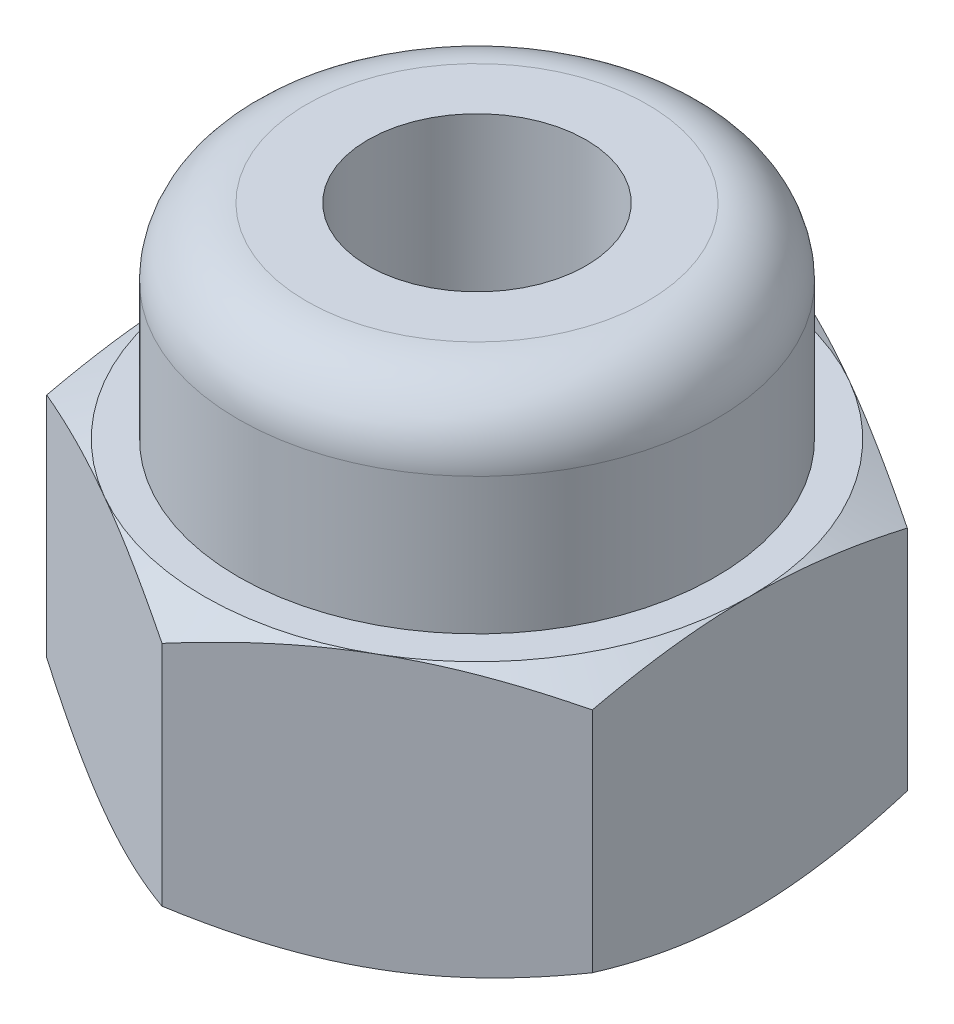
ISO-10303-21;
HEADER;
FILE_DESCRIPTION(('STEP AP214'),'2;1');
FILE_NAME('part.step','',(''),(''),'','','');
FILE_SCHEMA(('AUTOMOTIVE_DESIGN { 1 0 10303 214 1 1 1 1 }'));
ENDSEC;
DATA;
#1=APPLICATION_CONTEXT('core data for automotive mechanical design processes');
#2=APPLICATION_PROTOCOL_DEFINITION('international standard','automotive_design',2000,#1);
#3=PRODUCT_CONTEXT('',#1,'mechanical');
#4=PRODUCT('Part','Part','',(#3));
#5=PRODUCT_RELATED_PRODUCT_CATEGORY('part','',(#4));
#6=PRODUCT_DEFINITION_FORMATION('','',#4);
#7=PRODUCT_DEFINITION_CONTEXT('part definition',#1,'design');
#8=PRODUCT_DEFINITION('design','',#6,#7);
#9=PRODUCT_DEFINITION_SHAPE('','',#8);
#10=(LENGTH_UNIT() NAMED_UNIT(*) SI_UNIT(.MILLI.,.METRE.));
#11=(NAMED_UNIT(*) PLANE_ANGLE_UNIT() SI_UNIT($,.RADIAN.));
#12=(NAMED_UNIT(*) SI_UNIT($,.STERADIAN.) SOLID_ANGLE_UNIT());
#13=UNCERTAINTY_MEASURE_WITH_UNIT(LENGTH_MEASURE(1.E-05),#10,'distance_accuracy_value','');
#14=(GEOMETRIC_REPRESENTATION_CONTEXT(3) GLOBAL_UNCERTAINTY_ASSIGNED_CONTEXT((#13)) GLOBAL_UNIT_ASSIGNED_CONTEXT((#10,
#11,#12)) REPRESENTATION_CONTEXT('',''));
#15=CARTESIAN_POINT('',(0.,0.,0.));
#16=DIRECTION('',(0.,0.,1.));
#17=DIRECTION('',(1.,0.,0.));
#18=AXIS2_PLACEMENT_3D('',#15,#16,#17);
#19=CARTESIAN_POINT('',(0.,2.,0.));
#20=DIRECTION('',(0.,1.,0.));
#21=DIRECTION('',(0.,0.,1.));
#22=AXIS2_PLACEMENT_3D('',#19,#20,#21);
#23=PLANE('',#22);
#24=CARTESIAN_POINT('',(0.,2.,0.));
#25=DIRECTION('',(0.,1.,0.));
#26=DIRECTION('',(0.,0.,1.));
#27=AXIS2_PLACEMENT_3D('',#24,#25,#26);
#28=CIRCLE('',#27,1.75);
#29=CARTESIAN_POINT('',(0.,2.,1.75));
#30=VERTEX_POINT('',#29);
#31=EDGE_CURVE('E263',#30,#30,#28,.T.);
#32=ORIENTED_EDGE('',*,*,#31,.F.);
#33=EDGE_LOOP('',(#32));
#34=FACE_BOUND('',#33,.T.);
#35=CARTESIAN_POINT('',(0.,2.,0.));
#36=DIRECTION('',(0.,1.,0.));
#37=DIRECTION('',(0.,0.,1.));
#38=AXIS2_PLACEMENT_3D('',#35,#36,#37);
#39=CIRCLE('',#38,2.);
#40=CARTESIAN_POINT('',(-1.,2.,1.73205080756888));
#41=VERTEX_POINT('',#40);
#42=CARTESIAN_POINT('',(-2.,2.,0.));
#43=VERTEX_POINT('',#42);
#44=EDGE_CURVE('E11',#41,#43,#39,.F.);
#45=ORIENTED_EDGE('',*,*,#44,.F.);
#46=CARTESIAN_POINT('',(1.,2.,1.73205080756888));
#47=VERTEX_POINT('',#46);
#48=EDGE_CURVE('E47',#47,#41,#39,.F.);
#49=ORIENTED_EDGE('',*,*,#48,.F.);
#50=CARTESIAN_POINT('',(0.,2.,0.));
#51=DIRECTION('',(0.,-1.,0.));
#52=DIRECTION('',(1.,0.,0.));
#53=AXIS2_PLACEMENT_3D('',#50,#51,#52);
#54=CIRCLE('',#53,2.);
#55=CARTESIAN_POINT('',(2.,2.,0.));
#56=VERTEX_POINT('',#55);
#57=EDGE_CURVE('E157',#56,#47,#54,.T.);
#58=ORIENTED_EDGE('',*,*,#57,.F.);
#59=CARTESIAN_POINT('',(1.,2.,-1.73205080756888));
#60=VERTEX_POINT('',#59);
#61=EDGE_CURVE('E292',#60,#56,#39,.F.);
#62=ORIENTED_EDGE('',*,*,#61,.F.);
#63=CARTESIAN_POINT('',(-1.,2.,-1.73205080756888));
#64=VERTEX_POINT('',#63);
#65=EDGE_CURVE('E331',#64,#60,#39,.F.);
#66=ORIENTED_EDGE('',*,*,#65,.F.);
#67=EDGE_CURVE('E52',#43,#64,#39,.F.);
#68=ORIENTED_EDGE('',*,*,#67,.F.);
#69=EDGE_LOOP('',(#45,#49,#58,#62,#66,#68));
#70=FACE_BOUND('',#69,.T.);
#71=ADVANCED_FACE('F43',(#34,#70),#23,.T.);
#72=CARTESIAN_POINT('',(0.,0.,0.));
#73=DIRECTION('',(0.,1.,0.));
#74=DIRECTION('',(0.,0.,1.));
#75=AXIS2_PLACEMENT_3D('',#72,#73,#74);
#76=PLANE('',#75);
#77=CARTESIAN_POINT('',(0.,0.,0.));
#78=DIRECTION('',(0.,-1.,0.));
#79=DIRECTION('',(0.,0.,-1.));
#80=AXIS2_PLACEMENT_3D('',#77,#78,#79);
#81=CIRCLE('',#80,0.8);
#82=CARTESIAN_POINT('',(0.,0.,-0.8));
#83=VERTEX_POINT('',#82);
#84=EDGE_CURVE('E260',#83,#83,#81,.T.);
#85=ORIENTED_EDGE('',*,*,#84,.F.);
#86=EDGE_LOOP('',(#85));
#87=FACE_BOUND('',#86,.T.);
#88=CARTESIAN_POINT('',(0.,0.,0.));
#89=DIRECTION('',(0.,1.,0.));
#90=DIRECTION('',(0.,0.,1.));
#91=AXIS2_PLACEMENT_3D('',#88,#89,#90);
#92=CIRCLE('',#91,2.);
#93=CARTESIAN_POINT('',(1.,0.,1.73205080756888));
#94=VERTEX_POINT('',#93);
#95=CARTESIAN_POINT('',(-1.,0.,1.73205080756888));
#96=VERTEX_POINT('',#95);
#97=EDGE_CURVE('E163',#94,#96,#92,.F.);
#98=ORIENTED_EDGE('',*,*,#97,.T.);
#99=CARTESIAN_POINT('',(-2.,0.,0.));
#100=VERTEX_POINT('',#99);
#101=EDGE_CURVE('E286',#96,#100,#92,.F.);
#102=ORIENTED_EDGE('',*,*,#101,.T.);
#103=CARTESIAN_POINT('',(-1.,0.,-1.73205080756888));
#104=VERTEX_POINT('',#103);
#105=EDGE_CURVE('E289',#100,#104,#92,.F.);
#106=ORIENTED_EDGE('',*,*,#105,.T.);
#107=CARTESIAN_POINT('',(1.,0.,-1.73205080756888));
#108=VERTEX_POINT('',#107);
#109=EDGE_CURVE('E162',#104,#108,#92,.F.);
#110=ORIENTED_EDGE('',*,*,#109,.T.);
#111=CARTESIAN_POINT('',(2.,0.,0.));
#112=VERTEX_POINT('',#111);
#113=EDGE_CURVE('E137',#108,#112,#92,.F.);
#114=ORIENTED_EDGE('',*,*,#113,.T.);
#115=CARTESIAN_POINT('',(0.,0.,0.));
#116=DIRECTION('',(0.,-1.,0.));
#117=DIRECTION('',(1.,0.,0.));
#118=AXIS2_PLACEMENT_3D('',#115,#116,#117);
#119=CIRCLE('',#118,2.);
#120=EDGE_CURVE('E149',#112,#94,#119,.T.);
#121=ORIENTED_EDGE('',*,*,#120,.T.);
#122=EDGE_LOOP('',(#98,#102,#106,#110,#114,#121));
#123=FACE_BOUND('',#122,.T.);
#124=ADVANCED_FACE('F159',(#87,#123),#76,.F.);
#125=CARTESIAN_POINT('',(0.,3.5,0.));
#126=DIRECTION('',(0.,-1.,0.));
#127=DIRECTION('',(0.,0.,-1.));
#128=AXIS2_PLACEMENT_3D('',#125,#126,#127);
#129=CYLINDRICAL_SURFACE('',#128,1.75);
#130=CARTESIAN_POINT('',(0.,3.,0.));
#131=DIRECTION('',(0.,1.,0.));
#132=DIRECTION('',(0.,0.,1.));
#133=AXIS2_PLACEMENT_3D('',#130,#131,#132);
#134=CIRCLE('',#133,1.75);
#135=CARTESIAN_POINT('',(0.,3.,1.75));
#136=VERTEX_POINT('',#135);
#137=EDGE_CURVE('E284',#136,#136,#134,.F.);
#138=ORIENTED_EDGE('',*,*,#137,.T.);
#139=EDGE_LOOP('',(#138));
#140=FACE_BOUND('',#139,.T.);
#141=ORIENTED_EDGE('',*,*,#31,.T.);
#142=EDGE_LOOP('',(#141));
#143=FACE_BOUND('',#142,.T.);
#144=ADVANCED_FACE('F374',(#140,#143),#129,.T.);
#145=CARTESIAN_POINT('',(0.,3.5,0.));
#146=DIRECTION('',(0.,1.,0.));
#147=DIRECTION('',(0.,0.,1.));
#148=AXIS2_PLACEMENT_3D('',#145,#146,#147);
#149=PLANE('',#148);
#150=CARTESIAN_POINT('',(0.,3.5,0.));
#151=DIRECTION('',(0.,-1.,0.));
#152=DIRECTION('',(0.,0.,-1.));
#153=AXIS2_PLACEMENT_3D('',#150,#151,#152);
#154=CIRCLE('',#153,0.8);
#155=CARTESIAN_POINT('',(0.,3.5,-0.8));
#156=VERTEX_POINT('',#155);
#157=EDGE_CURVE('E257',#156,#156,#154,.T.);
#158=ORIENTED_EDGE('',*,*,#157,.T.);
#159=EDGE_LOOP('',(#158));
#160=FACE_BOUND('',#159,.T.);
#161=CARTESIAN_POINT('',(0.,3.5,0.));
#162=DIRECTION('',(0.,1.,0.));
#163=DIRECTION('',(0.,0.,1.));
#164=AXIS2_PLACEMENT_3D('',#161,#162,#163);
#165=CIRCLE('',#164,1.25);
#166=CARTESIAN_POINT('',(0.,3.5,1.25));
#167=VERTEX_POINT('',#166);
#168=EDGE_CURVE('E266',#167,#167,#165,.T.);
#169=ORIENTED_EDGE('',*,*,#168,.T.);
#170=EDGE_LOOP('',(#169));
#171=FACE_BOUND('',#170,.T.);
#172=ADVANCED_FACE('F437',(#160,#171),#149,.T.);
#173=CARTESIAN_POINT('',(0.,3.,0.));
#174=DIRECTION('',(0.,1.,0.));
#175=DIRECTION('',(0.,0.,1.));
#176=AXIS2_PLACEMENT_3D('',#173,#174,#175);
#177=TOROIDAL_SURFACE('',#176,1.25,0.5);
#178=ORIENTED_EDGE('',*,*,#137,.F.);
#179=EDGE_LOOP('',(#178));
#180=FACE_BOUND('',#179,.T.);
#181=ORIENTED_EDGE('',*,*,#168,.F.);
#182=EDGE_LOOP('',(#181));
#183=FACE_BOUND('',#182,.T.);
#184=ADVANCED_FACE('F45',(#180,#183),#177,.T.);
#185=CARTESIAN_POINT('',(0.,3.5,0.));
#186=DIRECTION('',(0.,-1.,0.));
#187=DIRECTION('',(0.,0.,-1.));
#188=AXIS2_PLACEMENT_3D('',#185,#186,#187);
#189=CYLINDRICAL_SURFACE('',#188,0.8);
#190=ORIENTED_EDGE('',*,*,#157,.F.);
#191=EDGE_LOOP('',(#190));
#192=FACE_BOUND('',#191,.T.);
#193=ORIENTED_EDGE('',*,*,#84,.T.);
#194=EDGE_LOOP('',(#193));
#195=FACE_BOUND('',#194,.T.);
#196=ADVANCED_FACE('F358',(#192,#195),#189,.F.);
#197=CARTESIAN_POINT('',(0.,0.884050334831859,0.));
#198=DIRECTION('',(0.,1.,0.));
#199=DIRECTION('',(-1.,0.,0.));
#200=AXIS2_PLACEMENT_3D('',#197,#198,#199);
#201=CONICAL_SURFACE('',#200,3.45415899174383,1.02455455899312);
#202=ORIENTED_EDGE('',*,*,#97,.F.);
#203=CARTESIAN_POINT('',(-0.000200000000000341,0.188169392793173,2.30951654681234));
#204=CARTESIAN_POINT('',(0.08810641262596,0.1571614703841,2.25853281571157));
#205=CARTESIAN_POINT('',(0.177258042441856,0.128943718737827,2.20706109823867));
#206=CARTESIAN_POINT('',(0.357280667463016,0.0797068626214569,2.10312498722248));
#207=CARTESIAN_POINT('',(0.44815569016462,0.0587076092329016,2.0506582684031));
#208=CARTESIAN_POINT('',(0.628655727518293,0.0261669851456631,1.94644652324822));
#209=CARTESIAN_POINT('',(0.71824649018686,0.0143816184531417,1.89472127230462));
#210=CARTESIAN_POINT('',(0.897882188006621,0.000503690005352546,1.79100855381231));
#211=CARTESIAN_POINT('',(0.98792630997134,-0.00160244250756122,1.73902155575704));
#212=CARTESIAN_POINT('',(1.15513921188781,0.00365993592734883,1.64248114182358));
#213=CARTESIAN_POINT('',(1.23234120290892,0.00974006505793735,1.59790855152557));
#214=CARTESIAN_POINT('',(1.38618448696233,0.0287198688394397,1.50908709006432));
#215=CARTESIAN_POINT('',(1.46282511606707,0.0416266037502898,1.46483860221983));
#216=CARTESIAN_POINT('',(1.61700754614459,0.0737825530186101,1.37582133471027));
#217=CARTESIAN_POINT('',(1.69452573293422,0.0931787874114283,1.33106618870018));
#218=CARTESIAN_POINT('',(1.84829288016005,0.137099374925336,1.24228868485683));
#219=CARTESIAN_POINT('',(1.92454425382321,0.161612374110546,1.19826493374633));
#220=CARTESIAN_POINT('',(2.0002,0.188169392793173,1.15458506832541));
#221=B_SPLINE_CURVE_WITH_KNOTS('',3,(#203,#204,#205,#206,#207,#208,#209,#210,#211,#212,#213,
#214,#215,#216,#217,#218,#219,#220),.UNSPECIFIED.,.F.,.F.,(4,2,2,2,2,2,2,2,4),(0.,
0.319880041039112,0.640632853003495,0.952573271486533,1.26407620061732,1.53185610068898,
1.79991348905184,2.07450902319197,2.3485015955544),.UNSPECIFIED.);
#222=CARTESIAN_POINT('',(0.,0.188099187955837,2.3094010767585));
#223=VERTEX_POINT('',#222);
#224=EDGE_CURVE('E356',#223,#94,#221,.T.);
#225=ORIENTED_EDGE('',*,*,#224,.F.);
#226=CARTESIAN_POINT('',(-2.0002,0.188169392793171,1.15458506832541));
#227=CARTESIAN_POINT('',(-1.91189358737404,0.157161470384099,1.20556879942618));
#228=CARTESIAN_POINT('',(-1.82274195755814,0.128943718737826,1.25704051689908));
#229=CARTESIAN_POINT('',(-1.64271933253698,0.0797068626214558,1.36097662791527));
#230=CARTESIAN_POINT('',(-1.55184430983538,0.0587076092329002,1.41344334673466));
#231=CARTESIAN_POINT('',(-1.37134427248171,0.0261669851456619,1.51765509188954));
#232=CARTESIAN_POINT('',(-1.28175350981314,0.0143816184531409,1.56938034283314));
#233=CARTESIAN_POINT('',(-1.10211781199338,0.000503690005351975,1.67309306132545));
#234=CARTESIAN_POINT('',(-1.01207369002866,-0.00160244250756194,1.72508005938072));
#235=CARTESIAN_POINT('',(-0.84486078811219,0.00365993592734836,1.82162047331417));
#236=CARTESIAN_POINT('',(-0.767658797091079,0.0097400650579372,1.86619306361219));
#237=CARTESIAN_POINT('',(-0.613815513037667,0.0287198688394397,1.95501452507344));
#238=CARTESIAN_POINT('',(-0.537174883932926,0.0416266037502897,1.99926301291792));
#239=CARTESIAN_POINT('',(-0.382992453855406,0.0737825530186099,2.08828028042749));
#240=CARTESIAN_POINT('',(-0.30547426706578,0.0931787874114283,2.13303542643757));
#241=CARTESIAN_POINT('',(-0.151707119839953,0.137099374925336,2.22181293028093));
#242=CARTESIAN_POINT('',(-0.0754557461767934,0.161612374110546,2.26583668139143));
#243=CARTESIAN_POINT('',(0.000199999999999875,0.188169392793173,2.30951654681234));
#244=B_SPLINE_CURVE_WITH_KNOTS('',3,(#226,#227,#228,#229,#230,#231,#232,#233,#234,#235,#236,
#237,#238,#239,#240,#241,#242,#243),.UNSPECIFIED.,.F.,.F.,(4,2,2,2,2,2,2,2,4),(0.,
0.319880041039112,0.640632853003494,0.952573271486532,1.26407620061732,1.53185610068898,
1.79991348905183,2.07450902319197,2.3485015955544),.UNSPECIFIED.);
#245=EDGE_CURVE('E211',#96,#223,#244,.T.);
#246=ORIENTED_EDGE('',*,*,#245,.F.);
#247=EDGE_LOOP('',(#202,#225,#246));
#248=FACE_BOUND('',#247,.T.);
#249=ADVANCED_FACE('F196',(#248),#201,.T.);
#250=CARTESIAN_POINT('',(2.,0.188099187955837,1.15470053837925));
#251=VERTEX_POINT('',#250);
#252=EDGE_CURVE('E152',#94,#251,#221,.T.);
#253=ORIENTED_EDGE('',*,*,#252,.F.);
#254=ORIENTED_EDGE('',*,*,#120,.F.);
#255=CARTESIAN_POINT('',(2.,1.30253252177215,3.62772854045494));
#256=CARTESIAN_POINT('',(2.,1.25905873686031,3.54606469434371));
#257=CARTESIAN_POINT('',(2.,1.2158449767541,3.46426174087384));
#258=CARTESIAN_POINT('',(2.,1.13005281287584,3.30032107000805));
#259=CARTESIAN_POINT('',(2.,1.08747442410626,3.21818334476558));
#260=CARTESIAN_POINT('',(2.,0.960735681772782,2.9709301589764));
#261=CARTESIAN_POINT('',(2.,0.877709149998918,2.8052310587314));
#262=CARTESIAN_POINT('',(2.,0.712187129390068,2.46362144609859));
#263=CARTESIAN_POINT('',(2.,0.629909880508418,2.28760353584497));
#264=CARTESIAN_POINT('',(2.,0.512317427979595,2.02104882958986));
#265=CARTESIAN_POINT('',(2.,0.474098722393946,1.93179699598215));
#266=CARTESIAN_POINT('',(2.,0.400155992515554,1.75226978852638));
#267=CARTESIAN_POINT('',(2.,0.364431756953661,1.66199450211426));
#268=CARTESIAN_POINT('',(2.,0.288785633473809,1.46057605132461));
#269=CARTESIAN_POINT('',(2.,0.249626849600514,1.34914222865002));
#270=CARTESIAN_POINT('',(2.,0.177722722188679,1.12424479686577));
#271=CARTESIAN_POINT('',(2.,0.144974358353034,1.01078217126953));
#272=CARTESIAN_POINT('',(2.,0.0885400172549857,0.783756748491698));
#273=CARTESIAN_POINT('',(2.,0.0647003518474962,0.670233143285225));
#274=CARTESIAN_POINT('',(2.,0.0274735335607466,0.441481279517172));
#275=CARTESIAN_POINT('',(2.,0.014081416371851,0.32625385710431));
#276=CARTESIAN_POINT('',(2.,-0.000737642919644076,0.0933590747330141));
#277=CARTESIAN_POINT('',(2.,-0.00199252687429058,-0.0243197345919548));
#278=CARTESIAN_POINT('',(2.,0.00809065518653032,-0.25913443272578));
#279=CARTESIAN_POINT('',(2.,0.0194311300729838,-0.376270213377034));
#280=CARTESIAN_POINT('',(2.,0.053561535218167,-0.611118656944656));
#281=CARTESIAN_POINT('',(2.,0.0765690195628063,-0.728798533198999));
#282=CARTESIAN_POINT('',(2.,0.131749346268494,-0.96196738503922));
#283=CARTESIAN_POINT('',(2.,0.163925348863797,-1.07745559052801));
#284=CARTESIAN_POINT('',(2.,0.233590163951723,-1.30130242745896));
#285=CARTESIAN_POINT('',(2.,0.270788682819093,-1.40975326924806));
#286=CARTESIAN_POINT('',(2.,0.34986286142506,-1.62495031968248));
#287=CARTESIAN_POINT('',(2.,0.391739833527841,-1.73169604037389));
#288=CARTESIAN_POINT('',(2.,0.479022899011564,-1.94388688844211));
#289=CARTESIAN_POINT('',(2.,0.524433580010922,-2.04933011204917));
#290=CARTESIAN_POINT('',(2.,0.617872233220062,-2.25905219224727));
#291=CARTESIAN_POINT('',(2.,0.665900383158932,-2.36333096919036));
#292=CARTESIAN_POINT('',(2.,0.76131686011448,-2.56537060916605));
#293=CARTESIAN_POINT('',(2.,0.808601111527028,-2.66318084301822));
#294=CARTESIAN_POINT('',(2.,0.904571961237477,-2.85811383882877));
#295=CARTESIAN_POINT('',(2.,0.953258612974454,-2.95523657441357));
#296=CARTESIAN_POINT('',(2.,1.05154254960329,-3.14852275485785));
#297=CARTESIAN_POINT('',(2.,1.1011353354064,-3.24468849342518));
#298=CARTESIAN_POINT('',(2.,1.20121382562715,-3.43654142743376));
#299=CARTESIAN_POINT('',(2.,1.25169943323391,-3.53222867333324));
#300=CARTESIAN_POINT('',(2.,1.30253252177215,-3.62772854045494));
#301=B_SPLINE_CURVE_WITH_KNOTS('',3,(#255,#256,#257,#258,#259,#260,#261,#262,#263,#264,#265,
#266,#267,#268,#269,#270,#271,#272,#273,#274,#275,#276,#277,#278,#279,#280,#281,#282,#283,#284,
#285,#286,#287,#288,#289,#290,#291,#292,#293,#294,#295,#296,#297,#298,#299,#300),.UNSPECIFIED.,
.F.,.F.,(4,2,2,2,2,2,2,2,2,2,2,2,2,2,2,2,2,2,2,2,2,2,4),(0.,0.277544047478177,0.555094638026591,
1.11106829718039,1.69382380019081,1.98506617270374,2.2762838484478,2.63048345312919,
2.98451577132152,3.33212267826951,3.6795643137947,4.03192420509897,4.38435149707917,
4.74360636350215,5.10298520914295,5.44680639010795,5.79072426049956,6.13509631825152,
6.47949178845859,6.80539811607052,7.13131687895674,7.45591256468878,7.78047326692877),.UNSPECIFIED.);
#302=EDGE_CURVE('E145',#251,#112,#301,.T.);
#303=ORIENTED_EDGE('',*,*,#302,.F.);
#304=EDGE_LOOP('',(#253,#254,#303));
#305=FACE_BOUND('',#304,.T.);
#306=ADVANCED_FACE('F150',(#305),#201,.T.);
#307=ORIENTED_EDGE('',*,*,#113,.F.);
#308=CARTESIAN_POINT('',(2.0002,0.188169392793173,-1.15458506832541));
#309=CARTESIAN_POINT('',(1.91189358737404,0.157161470384101,-1.20556879942618));
#310=CARTESIAN_POINT('',(1.82274195755814,0.128943718737827,-1.25704051689908));
#311=CARTESIAN_POINT('',(1.64271933253698,0.079706862621457,-1.36097662791527));
#312=CARTESIAN_POINT('',(1.55184430983538,0.0587076092329013,-1.41344334673466));
#313=CARTESIAN_POINT('',(1.37134427248171,0.0261669851456629,-1.51765509188954));
#314=CARTESIAN_POINT('',(1.28175350981314,0.0143816184531419,-1.56938034283314));
#315=CARTESIAN_POINT('',(1.10211781199338,0.000503690005352717,-1.67309306132544));
#316=CARTESIAN_POINT('',(1.01207369002866,-0.00160244250756134,-1.72508005938072));
#317=CARTESIAN_POINT('',(0.844860788112191,0.00365993592734849,-1.82162047331417));
#318=CARTESIAN_POINT('',(0.767658797091081,0.00974006505793703,-1.86619306361218));
#319=CARTESIAN_POINT('',(0.613815513037668,0.0287198688394395,-1.95501452507344));
#320=CARTESIAN_POINT('',(0.537174883932927,0.0416266037502896,-1.99926301291792));
#321=CARTESIAN_POINT('',(0.382992453855407,0.07378255301861,-2.08828028042749));
#322=CARTESIAN_POINT('',(0.305474267065781,0.0931787874114282,-2.13303542643757));
#323=CARTESIAN_POINT('',(0.151707119839954,0.137099374925336,-2.22181293028092));
#324=CARTESIAN_POINT('',(0.0754557461767938,0.161612374110546,-2.26583668139143));
#325=CARTESIAN_POINT('',(-0.000199999999999701,0.188169392793172,-2.30951654681234));
#326=B_SPLINE_CURVE_WITH_KNOTS('',3,(#308,#309,#310,#311,#312,#313,#314,#315,#316,#317,#318,
#319,#320,#321,#322,#323,#324,#325),.UNSPECIFIED.,.F.,.F.,(4,2,2,2,2,2,2,2,4),(0.,
0.319880041039112,0.640632853003495,0.952573271486532,1.26407620061732,1.53185610068898,
1.79991348905183,2.07450902319197,2.3485015955544),.UNSPECIFIED.);
#327=CARTESIAN_POINT('',(2.,0.188099187955837,-1.15470053837925));
#328=VERTEX_POINT('',#327);
#329=EDGE_CURVE('E140',#328,#108,#326,.T.);
#330=ORIENTED_EDGE('',*,*,#329,.F.);
#331=EDGE_CURVE('E133',#112,#328,#301,.T.);
#332=ORIENTED_EDGE('',*,*,#331,.F.);
#333=EDGE_LOOP('',(#307,#330,#332));
#334=FACE_BOUND('',#333,.T.);
#335=ADVANCED_FACE('F135',(#334),#201,.T.);
#336=ORIENTED_EDGE('',*,*,#109,.F.);
#337=CARTESIAN_POINT('',(0.000200000000000371,0.188169392793172,-2.30951654681234));
#338=CARTESIAN_POINT('',(-0.0881064126259598,0.1571614703841,-2.25853281571157));
#339=CARTESIAN_POINT('',(-0.177258042441856,0.128943718737826,-2.20706109823867));
#340=CARTESIAN_POINT('',(-0.357280667463015,0.0797068626214562,-2.10312498722248));
#341=CARTESIAN_POINT('',(-0.44815569016462,0.0587076092329006,-2.0506582684031));
#342=CARTESIAN_POINT('',(-0.628655727518293,0.026166985145662,-1.94644652324822));
#343=CARTESIAN_POINT('',(-0.71824649018686,0.0143816184531407,-1.89472127230462));
#344=CARTESIAN_POINT('',(-0.89788218800662,0.0005036900053517,-1.79100855381231));
#345=CARTESIAN_POINT('',(-0.98792630997134,-0.00160244250756203,-1.73902155575704));
#346=CARTESIAN_POINT('',(-1.15513921188781,0.00365993592734799,-1.64248114182358));
#347=CARTESIAN_POINT('',(-1.23234120290892,0.00974006505793645,-1.59790855152557));
#348=CARTESIAN_POINT('',(-1.38618448696233,0.0287198688394386,-1.50908709006432));
#349=CARTESIAN_POINT('',(-1.46282511606707,0.0416266037502885,-1.46483860221983));
#350=CARTESIAN_POINT('',(-1.61700754614459,0.0737825530186087,-1.37582133471027));
#351=CARTESIAN_POINT('',(-1.69452573293422,0.0931787874114269,-1.33106618870018));
#352=CARTESIAN_POINT('',(-1.84829288016005,0.137099374925334,-1.24228868485683));
#353=CARTESIAN_POINT('',(-1.92454425382321,0.161612374110545,-1.19826493374633));
#354=CARTESIAN_POINT('',(-2.0002,0.188169392793171,-1.15458506832541));
#355=B_SPLINE_CURVE_WITH_KNOTS('',3,(#337,#338,#339,#340,#341,#342,#343,#344,#345,#346,#347,
#348,#349,#350,#351,#352,#353,#354),.UNSPECIFIED.,.F.,.F.,(4,2,2,2,2,2,2,2,4),(0.,
0.319880041039112,0.640632853003495,0.952573271486533,1.26407620061732,1.53185610068898,
1.79991348905183,2.07450902319197,2.3485015955544),.UNSPECIFIED.);
#356=CARTESIAN_POINT('',(0.,0.188099187955836,-2.3094010767585));
#357=VERTEX_POINT('',#356);
#358=EDGE_CURVE('E232',#357,#104,#355,.T.);
#359=ORIENTED_EDGE('',*,*,#358,.F.);
#360=EDGE_CURVE('E179',#108,#357,#326,.T.);
#361=ORIENTED_EDGE('',*,*,#360,.F.);
#362=EDGE_LOOP('',(#336,#359,#361));
#363=FACE_BOUND('',#362,.T.);
#364=ADVANCED_FACE('F393',(#363),#201,.T.);
#365=ORIENTED_EDGE('',*,*,#105,.F.);
#366=CARTESIAN_POINT('',(-2.,1.30253252177215,-3.62772854045494));
#367=CARTESIAN_POINT('',(-2.,1.25905873686031,-3.54606469434371));
#368=CARTESIAN_POINT('',(-2.,1.2158449767541,-3.46426174087384));
#369=CARTESIAN_POINT('',(-2.,1.13005281287584,-3.30032107000805));
#370=CARTESIAN_POINT('',(-2.,1.08747442410626,-3.21818334476558));
#371=CARTESIAN_POINT('',(-2.,0.96073568177278,-2.9709301589764));
#372=CARTESIAN_POINT('',(-2.,0.877709149998917,-2.8052310587314));
#373=CARTESIAN_POINT('',(-2.,0.712187129390067,-2.46362144609859));
#374=CARTESIAN_POINT('',(-2.,0.629909880508417,-2.28760353584497));
#375=CARTESIAN_POINT('',(-2.,0.512317427979594,-2.02104882958986));
#376=CARTESIAN_POINT('',(-2.,0.474098722393945,-1.93179699598215));
#377=CARTESIAN_POINT('',(-2.,0.400155992515552,-1.75226978852638));
#378=CARTESIAN_POINT('',(-2.,0.364431756953659,-1.66199450211426));
#379=CARTESIAN_POINT('',(-2.,0.288785633473808,-1.46057605132461));
#380=CARTESIAN_POINT('',(-2.,0.249626849600513,-1.34914222865002));
#381=CARTESIAN_POINT('',(-2.,0.177722722188678,-1.12424479686577));
#382=CARTESIAN_POINT('',(-2.,0.144974358353033,-1.01078217126953));
#383=CARTESIAN_POINT('',(-2.,0.0885400172549842,-0.783756748491698));
#384=CARTESIAN_POINT('',(-2.,0.0647003518474946,-0.670233143285225));
#385=CARTESIAN_POINT('',(-2.,0.0274735335607449,-0.441481279517172));
#386=CARTESIAN_POINT('',(-2.,0.0140814163718492,-0.32625385710431));
#387=CARTESIAN_POINT('',(-2.,-0.000737642919646016,-0.0933590747330137));
#388=CARTESIAN_POINT('',(-2.,-0.00199252687429265,0.0243197345919555));
#389=CARTESIAN_POINT('',(-2.,0.00809065518652828,0.259134432725781));
#390=CARTESIAN_POINT('',(-2.,0.0194311300729819,0.376270213377035));
#391=CARTESIAN_POINT('',(-2.,0.0535615352181652,0.611118656944657));
#392=CARTESIAN_POINT('',(-2.,0.0765690195628045,0.728798533199));
#393=CARTESIAN_POINT('',(-2.,0.131749346268493,0.96196738503922));
#394=CARTESIAN_POINT('',(-2.,0.163925348863795,1.07745559052801));
#395=CARTESIAN_POINT('',(-2.,0.233590163951722,1.30130242745896));
#396=CARTESIAN_POINT('',(-2.,0.270788682819091,1.40975326924806));
#397=CARTESIAN_POINT('',(-2.,0.349862861425057,1.62495031968248));
#398=CARTESIAN_POINT('',(-2.,0.391739833527839,1.73169604037389));
#399=CARTESIAN_POINT('',(-2.,0.479022899011561,1.94388688844211));
#400=CARTESIAN_POINT('',(-2.,0.524433580010919,2.04933011204917));
#401=CARTESIAN_POINT('',(-2.,0.617872233220059,2.25905219224727));
#402=CARTESIAN_POINT('',(-2.,0.66590038315893,2.36333096919036));
#403=CARTESIAN_POINT('',(-2.,0.761316860114478,2.56537060916605));
#404=CARTESIAN_POINT('',(-2.,0.808601111527026,2.66318084301822));
#405=CARTESIAN_POINT('',(-2.,0.904571961237475,2.85811383882877));
#406=CARTESIAN_POINT('',(-2.,0.953258612974451,2.95523657441357));
#407=CARTESIAN_POINT('',(-2.,1.05154254960328,3.14852275485785));
#408=CARTESIAN_POINT('',(-2.,1.1011353354064,3.24468849342518));
#409=CARTESIAN_POINT('',(-2.,1.20121382562715,3.43654142743376));
#410=CARTESIAN_POINT('',(-2.,1.25169943323391,3.53222867333324));
#411=CARTESIAN_POINT('',(-2.,1.30253252177215,3.62772854045495));
#412=B_SPLINE_CURVE_WITH_KNOTS('',3,(#366,#367,#368,#369,#370,#371,#372,#373,#374,#375,#376,
#377,#378,#379,#380,#381,#382,#383,#384,#385,#386,#387,#388,#389,#390,#391,#392,#393,#394,#395,
#396,#397,#398,#399,#400,#401,#402,#403,#404,#405,#406,#407,#408,#409,#410,#411),.UNSPECIFIED.,
.F.,.F.,(4,2,2,2,2,2,2,2,2,2,2,2,2,2,2,2,2,2,2,2,2,2,4),(0.,0.277544047478177,0.55509463802659,
1.11106829718039,1.69382380019081,1.98506617270374,2.2762838484478,2.63048345312919,
2.98451577132152,3.33212267826951,3.67956431379471,4.03192420509897,4.38435149707917,
4.74360636350215,5.10298520914295,5.44680639010795,5.79072426049956,6.13509631825152,
6.47949178845859,6.80539811607052,7.13131687895674,7.45591256468878,7.78047326692877),.UNSPECIFIED.);
#413=CARTESIAN_POINT('',(-2.,0.188099187955835,-1.15470053837925));
#414=VERTEX_POINT('',#413);
#415=EDGE_CURVE('E233',#414,#100,#412,.T.);
#416=ORIENTED_EDGE('',*,*,#415,.F.);
#417=EDGE_CURVE('E225',#104,#414,#355,.T.);
#418=ORIENTED_EDGE('',*,*,#417,.F.);
#419=EDGE_LOOP('',(#365,#416,#418));
#420=FACE_BOUND('',#419,.T.);
#421=ADVANCED_FACE('F366',(#420),#201,.T.);
#422=ORIENTED_EDGE('',*,*,#101,.F.);
#423=CARTESIAN_POINT('',(-2.,0.188099187955835,1.15470053837925));
#424=VERTEX_POINT('',#423);
#425=EDGE_CURVE('E354',#424,#96,#244,.T.);
#426=ORIENTED_EDGE('',*,*,#425,.F.);
#427=EDGE_CURVE('E219',#100,#424,#412,.T.);
#428=ORIENTED_EDGE('',*,*,#427,.F.);
#429=EDGE_LOOP('',(#422,#426,#428));
#430=FACE_BOUND('',#429,.T.);
#431=ADVANCED_FACE('F359',(#430),#201,.T.);
#432=CARTESIAN_POINT('',(0.,2.,0.));
#433=DIRECTION('',(0.,-1.,0.));
#434=DIRECTION('',(1.,0.,0.));
#435=AXIS2_PLACEMENT_3D('',#432,#433,#434);
#436=CONICAL_SURFACE('',#435,2.,1.13838026412216);
#437=CARTESIAN_POINT('',(2.0002,1.85714309376993,1.15458506832541));
#438=CARTESIAN_POINT('',(1.93908380770956,1.87343079608467,1.18987051839615));
#439=CARTESIAN_POINT('',(1.87774389584387,1.88866058512047,1.22528513302387));
#440=CARTESIAN_POINT('',(1.75460777728626,1.91663490172645,1.29637780422007));
#441=CARTESIAN_POINT('',(1.69281134091309,1.9293780753145,1.33205599339508));
#442=CARTESIAN_POINT('',(1.56876681338965,1.95200087085602,1.40367313475224));
#443=CARTESIAN_POINT('',(1.50651838167884,1.96187803873871,1.43961228355711));
#444=CARTESIAN_POINT('',(1.38170872778509,1.97839839374387,1.51167117083013));
#445=CARTESIAN_POINT('',(1.31914756720708,1.98504219427074,1.54779087373065));
#446=CARTESIAN_POINT('',(1.19510102819685,1.99472591591905,1.61940917642025));
#447=CARTESIAN_POINT('',(1.13361985776272,1.99783685779775,1.65490534672049));
#448=CARTESIAN_POINT('',(1.01059207491554,2.00056402440326,1.72593547026511));
#449=CARTESIAN_POINT('',(0.949045456374287,2.00017988649328,1.76146942704762));
#450=CARTESIAN_POINT('',(0.826104808142413,1.99593508585308,1.83244924339864));
#451=CARTESIAN_POINT('',(0.764710687682334,1.99207786847216,1.86789515537292));
#452=CARTESIAN_POINT('',(0.642145909231664,1.98105404340392,1.93865796320459));
#453=CARTESIAN_POINT('',(0.580975257235278,1.9738873475923,1.9739748556012));
#454=CARTESIAN_POINT('',(0.476401067075827,1.95900325524885,2.03435079244005));
#455=CARTESIAN_POINT('',(0.432916342143077,1.95202867297977,2.05945671008561));
#456=CARTESIAN_POINT('',(0.346138870313153,1.93665503252586,2.10955770680621));
#457=CARTESIAN_POINT('',(0.302846112483627,1.92825605655646,2.13455279219305));
#458=CARTESIAN_POINT('',(0.216132807422283,1.91009244451977,2.18461674221254));
#459=CARTESIAN_POINT('',(0.172713846738656,1.90031778236438,2.20968469085117));
#460=CARTESIAN_POINT('',(0.0860939211238421,1.87958518329921,2.25969472822206));
#461=CARTESIAN_POINT('',(0.0428929278799029,1.86862740443972,2.28463683330071));
#462=CARTESIAN_POINT('',(-0.000200000000000576,1.85714309376993,2.30951654681234));
#463=B_SPLINE_CURVE_WITH_KNOTS('',3,(#437,#438,#439,#440,#441,#442,#443,#444,#445,#446,#447,
#448,#449,#450,#451,#452,#453,#454,#455,#456,#457,#458,#459,#460,#461,#462),.UNSPECIFIED.,.F.,
.F.,(4,2,2,2,2,2,2,2,2,2,2,2,4),(0.,0.217290859558755,0.434699707592374,0.652294170331244,
0.869847336964283,1.0829450200363,1.29606481360194,1.50897342163641,1.72188769929724,
1.8739494027894,2.02600233232592,2.17922711249031,2.33243144891811),.UNSPECIFIED.);
#464=CARTESIAN_POINT('',(0.,1.85719639279861,2.3094010767585));
#465=VERTEX_POINT('',#464);
#466=EDGE_CURVE('E169',#47,#465,#463,.T.);
#467=ORIENTED_EDGE('',*,*,#466,.F.);
#468=ORIENTED_EDGE('',*,*,#48,.T.);
#469=CARTESIAN_POINT('',(0.000199999999999697,1.85714309376993,2.30951654681234));
#470=CARTESIAN_POINT('',(-0.0609161922904434,1.87343079608467,2.27423109674161));
#471=CARTESIAN_POINT('',(-0.122256104156132,1.88866058512047,2.23881648211389));
#472=CARTESIAN_POINT('',(-0.24539222271374,1.91663490172645,2.16772381091769));
#473=CARTESIAN_POINT('',(-0.30718865908691,1.9293780753145,2.13204562174268));
#474=CARTESIAN_POINT('',(-0.431233186610349,1.95200087085602,2.06042848038552));
#475=CARTESIAN_POINT('',(-0.493481618321163,1.9618780387387,2.02448933158065));
#476=CARTESIAN_POINT('',(-0.618291272214914,1.97839839374387,1.95243044430763));
#477=CARTESIAN_POINT('',(-0.680852432792917,1.98504219427074,1.9163107414071));
#478=CARTESIAN_POINT('',(-0.804898971803152,1.99472591591905,1.8446924387175));
#479=CARTESIAN_POINT('',(-0.866380142237284,1.99783685779775,1.80919626841726));
#480=CARTESIAN_POINT('',(-0.989407925084458,2.00056402440326,1.73816614487264));
#481=CARTESIAN_POINT('',(-1.05095454362571,2.00017988649327,1.70263218809014));
#482=CARTESIAN_POINT('',(-1.17389519185759,1.99593508585308,1.63165237173912));
#483=CARTESIAN_POINT('',(-1.23528931231767,1.99207786847216,1.59620645976483));
#484=CARTESIAN_POINT('',(-1.35785409076834,1.98105404340392,1.52544365193317));
#485=CARTESIAN_POINT('',(-1.41902474276472,1.9738873475923,1.49012675953655));
#486=CARTESIAN_POINT('',(-1.52359893292417,1.95900325524885,1.42975082269771));
#487=CARTESIAN_POINT('',(-1.56708365785692,1.95202867297977,1.40464490505215));
#488=CARTESIAN_POINT('',(-1.65386112968685,1.93665503252586,1.35454390833154));
#489=CARTESIAN_POINT('',(-1.69715388751637,1.92825605655646,1.32954882294471));
#490=CARTESIAN_POINT('',(-1.78386719257772,1.91009244451976,1.27948487292522));
#491=CARTESIAN_POINT('',(-1.82728615326134,1.90031778236438,1.25441692428659));
#492=CARTESIAN_POINT('',(-1.91390607887616,1.87958518329921,1.20440688691569));
#493=CARTESIAN_POINT('',(-1.9571070721201,1.86862740443972,1.17946478183705));
#494=CARTESIAN_POINT('',(-2.0002,1.85714309376993,1.15458506832541));
#495=B_SPLINE_CURVE_WITH_KNOTS('',3,(#469,#470,#471,#472,#473,#474,#475,#476,#477,#478,#479,
#480,#481,#482,#483,#484,#485,#486,#487,#488,#489,#490,#491,#492,#493,#494),.UNSPECIFIED.,.F.,
.F.,(4,2,2,2,2,2,2,2,2,2,2,2,4),(0.,0.217290859558755,0.434699707592374,0.652294170331244,
0.869847336964283,1.0829450200363,1.29606481360194,1.50897342163641,1.72188769929724,
1.8739494027894,2.02600233232592,2.17922711249031,2.33243144891811),.UNSPECIFIED.);
#496=EDGE_CURVE('E312',#465,#41,#495,.T.);
#497=ORIENTED_EDGE('',*,*,#496,.F.);
#498=EDGE_LOOP('',(#467,#468,#497));
#499=FACE_BOUND('',#498,.T.);
#500=ADVANCED_FACE('F345',(#499),#436,.T.);
#501=ORIENTED_EDGE('',*,*,#57,.T.);
#502=CARTESIAN_POINT('',(2.,1.85719639279861,1.15470053837925));
#503=VERTEX_POINT('',#502);
#504=EDGE_CURVE('E171',#503,#47,#463,.T.);
#505=ORIENTED_EDGE('',*,*,#504,.F.);
#506=CARTESIAN_POINT('',(2.,1.03850043059618,-3.55985286337287));
#507=CARTESIAN_POINT('',(2.,1.08210921215597,-3.4514439101416));
#508=CARTESIAN_POINT('',(2.,1.12533064109362,-3.34287621431258));
#509=CARTESIAN_POINT('',(2.,1.2107404825478,-3.12531958192604));
#510=CARTESIAN_POINT('',(2.,1.25292876130421,-3.01633059291734));
#511=CARTESIAN_POINT('',(2.,1.33619603304714,-2.79734684802876));
#512=CARTESIAN_POINT('',(2.,1.37726894609758,-2.68734977200149));
#513=CARTESIAN_POINT('',(2.,1.45771065384618,-2.46673696341281));
#514=CARTESIAN_POINT('',(2.,1.49707951891755,-2.35612125661284));
#515=CARTESIAN_POINT('',(2.,1.57335279521352,-2.13480628243562));
#516=CARTESIAN_POINT('',(2.,1.6102709777529,-2.02411178891381));
#517=CARTESIAN_POINT('',(2.,1.6812020967977,-1.80177676058227));
#518=CARTESIAN_POINT('',(2.,1.71521475122487,-1.69013613507283));
#519=CARTESIAN_POINT('',(2.,1.77931911730406,-1.46590279413176));
#520=CARTESIAN_POINT('',(2.,1.80941667793052,-1.35331177290123));
#521=CARTESIAN_POINT('',(2.,1.86448497541698,-1.12689675302776));
#522=CARTESIAN_POINT('',(2.,1.88945700887145,-1.01307307389698));
#523=CARTESIAN_POINT('',(2.,1.93690956958085,-0.762171607986713));
#524=CARTESIAN_POINT('',(2.,1.95799450316437,-0.624819371395089));
#525=CARTESIAN_POINT('',(2.,1.98809922985505,-0.348831490003545));
#526=CARTESIAN_POINT('',(2.,1.99712713138691,-0.210196770920682));
#527=CARTESIAN_POINT('',(2.,2.00169433601309,0.0672492547261384));
#528=CARTESIAN_POINT('',(2.,1.99723925146971,0.20606046378036));
#529=CARTESIAN_POINT('',(2.,1.97559067839587,0.482708775766405));
#530=CARTESIAN_POINT('',(2.,1.958390564593,0.620545334408288));
#531=CARTESIAN_POINT('',(2.,1.9163242590975,0.877943316206976));
#532=CARTESIAN_POINT('',(2.,1.89263191582684,0.99770504659726));
#533=CARTESIAN_POINT('',(2.,1.83904633965632,1.23585222181118));
#534=CARTESIAN_POINT('',(2.,1.8091509056027,1.35423716229317));
#535=CARTESIAN_POINT('',(2.,1.74465108941158,1.58999772826948));
#536=CARTESIAN_POINT('',(2.,1.71003575207768,1.70737030947621));
#537=CARTESIAN_POINT('',(2.,1.63736281193047,1.9410177321887));
#538=CARTESIAN_POINT('',(2.,1.59930565625328,2.05729271412529));
#539=CARTESIAN_POINT('',(2.,1.52012876518934,2.29043069330668));
#540=CARTESIAN_POINT('',(2.,1.47897638242478,2.40728252710016));
#541=CARTESIAN_POINT('',(2.,1.39469369100877,2.64027424220204));
#542=CARTESIAN_POINT('',(2.,1.35156327869099,2.75641408583337));
#543=CARTESIAN_POINT('',(2.,1.26408697192565,2.9873676145962));
#544=CARTESIAN_POINT('',(2.,1.21975083220321,3.10218500952231));
#545=CARTESIAN_POINT('',(2.,1.1299185431899,3.33134421884716));
#546=CARTESIAN_POINT('',(2.,1.0844225833033,3.44568610739581));
#547=CARTESIAN_POINT('',(2.,1.03850043059618,3.55985286337287));
#548=B_SPLINE_CURVE_WITH_KNOTS('',3,(#506,#507,#508,#509,#510,#511,#512,#513,#514,#515,#516,
#517,#518,#519,#520,#521,#522,#523,#524,#525,#526,#527,#528,#529,#530,#531,#532,#533,#534,#535,
#536,#537,#538,#539,#540,#541,#542,#543,#544,#545,#546,#547),.UNSPECIFIED.,.F.,.F.,(4,2,2,2,2,2,
2,2,2,2,2,2,2,2,2,2,2,2,2,2,4),(0.,0.35055723048068,0.701159609572372,1.05339451700991,
1.40561486405942,1.75565054664453,2.1057201733179,2.45526065362778,2.8047126020977,
3.2211625234789,3.63733223858393,4.05332874473432,4.4695416509683,4.83558905939595,
5.20176658179888,5.56880897133682,5.93580374569423,6.30744026039606,6.67909627446171,
7.04832986678587,7.41750354292031),.UNSPECIFIED.);
#549=EDGE_CURVE('E305',#56,#503,#548,.T.);
#550=ORIENTED_EDGE('',*,*,#549,.F.);
#551=EDGE_LOOP('',(#501,#505,#550));
#552=FACE_BOUND('',#551,.T.);
#553=ADVANCED_FACE('F343',(#552),#436,.T.);
#554=ORIENTED_EDGE('',*,*,#61,.T.);
#555=CARTESIAN_POINT('',(2.,1.85719639279865,-1.15470053837929));
#556=VERTEX_POINT('',#555);
#557=EDGE_CURVE('E304',#556,#56,#548,.T.);
#558=ORIENTED_EDGE('',*,*,#557,.F.);
#559=CARTESIAN_POINT('',(-0.000199999999999697,1.85714309376993,-2.30951654681234));
#560=CARTESIAN_POINT('',(0.0609161922904435,1.87343079608467,-2.27423109674161));
#561=CARTESIAN_POINT('',(0.122256104156132,1.88866058512047,-2.23881648211389));
#562=CARTESIAN_POINT('',(0.245392222713741,1.91663490172645,-2.16772381091769));
#563=CARTESIAN_POINT('',(0.307188659086911,1.9293780753145,-2.13204562174268));
#564=CARTESIAN_POINT('',(0.431233186610349,1.95200087085602,-2.06042848038552));
#565=CARTESIAN_POINT('',(0.493481618321163,1.9618780387387,-2.02448933158065));
#566=CARTESIAN_POINT('',(0.618291272214914,1.97839839374387,-1.95243044430763));
#567=CARTESIAN_POINT('',(0.680852432792918,1.98504219427074,-1.9163107414071));
#568=CARTESIAN_POINT('',(0.804898971803152,1.99472591591905,-1.8446924387175));
#569=CARTESIAN_POINT('',(0.866380142237285,1.99783685779775,-1.80919626841726));
#570=CARTESIAN_POINT('',(0.989407925084458,2.00056402440326,-1.73816614487264));
#571=CARTESIAN_POINT('',(1.05095454362571,2.00017988649328,-1.70263218809014));
#572=CARTESIAN_POINT('',(1.17389519185759,1.99593508585308,-1.63165237173912));
#573=CARTESIAN_POINT('',(1.23528931231767,1.99207786847216,-1.59620645976483));
#574=CARTESIAN_POINT('',(1.35785409076834,1.98105404340392,-1.52544365193317));
#575=CARTESIAN_POINT('',(1.41902474276472,1.9738873475923,-1.49012675953655));
#576=CARTESIAN_POINT('',(1.52359893292417,1.95900325524885,-1.42975082269771));
#577=CARTESIAN_POINT('',(1.56708365785692,1.95202867297977,-1.40464490505214));
#578=CARTESIAN_POINT('',(1.65386112968685,1.93665503252586,-1.35454390833154));
#579=CARTESIAN_POINT('',(1.69715388751637,1.92825605655646,-1.32954882294471));
#580=CARTESIAN_POINT('',(1.78386719257772,1.91009244451977,-1.27948487292522));
#581=CARTESIAN_POINT('',(1.82728615326134,1.90031778236438,-1.25441692428659));
#582=CARTESIAN_POINT('',(1.91390607887616,1.87958518329922,-1.20440688691569));
#583=CARTESIAN_POINT('',(1.9571070721201,1.86862740443972,-1.17946478183704));
#584=CARTESIAN_POINT('',(2.0002,1.85714309376993,-1.15458506832541));
#585=B_SPLINE_CURVE_WITH_KNOTS('',3,(#559,#560,#561,#562,#563,#564,#565,#566,#567,#568,#569,
#570,#571,#572,#573,#574,#575,#576,#577,#578,#579,#580,#581,#582,#583,#584),.UNSPECIFIED.,.F.,
.F.,(4,2,2,2,2,2,2,2,2,2,2,2,4),(0.,0.217290859558756,0.434699707592374,0.652294170331244,
0.869847336964283,1.0829450200363,1.29606481360194,1.50897342163641,1.72188769929724,
1.8739494027894,2.02600233232592,2.17922711249031,2.33243144891811),.UNSPECIFIED.);
#586=EDGE_CURVE('E251',#60,#556,#585,.T.);
#587=ORIENTED_EDGE('',*,*,#586,.F.);
#588=EDGE_LOOP('',(#554,#558,#587));
#589=FACE_BOUND('',#588,.T.);
#590=ADVANCED_FACE('F338',(#589),#436,.T.);
#591=ORIENTED_EDGE('',*,*,#65,.T.);
#592=CARTESIAN_POINT('',(0.,1.85719639279861,-2.3094010767585));
#593=VERTEX_POINT('',#592);
#594=EDGE_CURVE('E328',#593,#60,#585,.T.);
#595=ORIENTED_EDGE('',*,*,#594,.F.);
#596=CARTESIAN_POINT('',(-2.0002,1.85714309376993,-1.15458506832541));
#597=CARTESIAN_POINT('',(-1.93908380770956,1.87343079608467,-1.18987051839615));
#598=CARTESIAN_POINT('',(-1.87774389584387,1.88866058512047,-1.22528513302387));
#599=CARTESIAN_POINT('',(-1.75460777728626,1.91663490172645,-1.29637780422007));
#600=CARTESIAN_POINT('',(-1.69281134091309,1.9293780753145,-1.33205599339508));
#601=CARTESIAN_POINT('',(-1.56876681338965,1.95200087085602,-1.40367313475224));
#602=CARTESIAN_POINT('',(-1.50651838167884,1.9618780387387,-1.43961228355711));
#603=CARTESIAN_POINT('',(-1.38170872778509,1.97839839374387,-1.51167117083013));
#604=CARTESIAN_POINT('',(-1.31914756720708,1.98504219427074,-1.54779087373065));
#605=CARTESIAN_POINT('',(-1.19510102819685,1.99472591591905,-1.61940917642025));
#606=CARTESIAN_POINT('',(-1.13361985776272,1.99783685779775,-1.65490534672049));
#607=CARTESIAN_POINT('',(-1.01059207491554,2.00056402440326,-1.72593547026511));
#608=CARTESIAN_POINT('',(-0.949045456374287,2.00017988649328,-1.76146942704762));
#609=CARTESIAN_POINT('',(-0.826104808142413,1.99593508585308,-1.83244924339864));
#610=CARTESIAN_POINT('',(-0.764710687682334,1.99207786847216,-1.86789515537292));
#611=CARTESIAN_POINT('',(-0.642145909231664,1.98105404340392,-1.93865796320459));
#612=CARTESIAN_POINT('',(-0.580975257235278,1.9738873475923,-1.9739748556012));
#613=CARTESIAN_POINT('',(-0.476401067075827,1.95900325524885,-2.03435079244005));
#614=CARTESIAN_POINT('',(-0.432916342143077,1.95202867297977,-2.05945671008561));
#615=CARTESIAN_POINT('',(-0.346138870313153,1.93665503252586,-2.10955770680621));
#616=CARTESIAN_POINT('',(-0.302846112483627,1.92825605655646,-2.13455279219305));
#617=CARTESIAN_POINT('',(-0.216132807422283,1.91009244451977,-2.18461674221254));
#618=CARTESIAN_POINT('',(-0.172713846738656,1.90031778236438,-2.20968469085116));
#619=CARTESIAN_POINT('',(-0.0860939211238422,1.87958518329921,-2.25969472822206));
#620=CARTESIAN_POINT('',(-0.0428929278799033,1.86862740443972,-2.28463683330071));
#621=CARTESIAN_POINT('',(0.000200000000000465,1.85714309376993,-2.30951654681234));
#622=B_SPLINE_CURVE_WITH_KNOTS('',3,(#596,#597,#598,#599,#600,#601,#602,#603,#604,#605,#606,
#607,#608,#609,#610,#611,#612,#613,#614,#615,#616,#617,#618,#619,#620,#621),.UNSPECIFIED.,.F.,
.F.,(4,2,2,2,2,2,2,2,2,2,2,2,4),(0.,0.217290859558755,0.434699707592374,0.652294170331244,
0.869847336964283,1.0829450200363,1.29606481360194,1.50897342163641,1.72188769929724,
1.8739494027894,2.02600233232592,2.17922711249031,2.33243144891811),.UNSPECIFIED.);
#623=EDGE_CURVE('E66',#64,#593,#622,.T.);
#624=ORIENTED_EDGE('',*,*,#623,.F.);
#625=EDGE_LOOP('',(#591,#595,#624));
#626=FACE_BOUND('',#625,.T.);
#627=ADVANCED_FACE('F329',(#626),#436,.T.);
#628=CARTESIAN_POINT('',(-2.,1.03850043059618,3.55985286337288));
#629=CARTESIAN_POINT('',(-2.,1.08210921215596,3.4514439101416));
#630=CARTESIAN_POINT('',(-2.,1.12533064109362,3.34287621431259));
#631=CARTESIAN_POINT('',(-2.,1.2107404825478,3.12531958192604));
#632=CARTESIAN_POINT('',(-2.,1.2529287613042,3.01633059291734));
#633=CARTESIAN_POINT('',(-2.,1.33619603304714,2.79734684802876));
#634=CARTESIAN_POINT('',(-2.,1.37726894609758,2.6873497720015));
#635=CARTESIAN_POINT('',(-2.,1.45771065384618,2.46673696341281));
#636=CARTESIAN_POINT('',(-2.,1.49707951891755,2.35612125661285));
#637=CARTESIAN_POINT('',(-2.,1.57335279521352,2.13480628243563));
#638=CARTESIAN_POINT('',(-2.,1.6102709777529,2.02411178891381));
#639=CARTESIAN_POINT('',(-2.,1.68120209679769,1.80177676058227));
#640=CARTESIAN_POINT('',(-2.,1.71521475122487,1.69013613507283));
#641=CARTESIAN_POINT('',(-2.,1.77931911730406,1.46590279413177));
#642=CARTESIAN_POINT('',(-2.,1.80941667793052,1.35331177290123));
#643=CARTESIAN_POINT('',(-2.,1.86448497541698,1.12689675302776));
#644=CARTESIAN_POINT('',(-2.,1.88945700887145,1.01307307389698));
#645=CARTESIAN_POINT('',(-2.,1.93690956958085,0.762171607986717));
#646=CARTESIAN_POINT('',(-2.,1.95799450316437,0.624819371395093));
#647=CARTESIAN_POINT('',(-2.,1.98809922985505,0.34883149000355));
#648=CARTESIAN_POINT('',(-2.,1.99712713138691,0.210196770920688));
#649=CARTESIAN_POINT('',(-2.,2.00169433601309,-0.0672492547261326));
#650=CARTESIAN_POINT('',(-2.,1.99723925146971,-0.206060463780354));
#651=CARTESIAN_POINT('',(-2.,1.97559067839587,-0.482708775766399));
#652=CARTESIAN_POINT('',(-2.,1.958390564593,-0.620545334408281));
#653=CARTESIAN_POINT('',(-2.,1.9163242590975,-0.87794331620697));
#654=CARTESIAN_POINT('',(-2.,1.89263191582684,-0.997705046597254));
#655=CARTESIAN_POINT('',(-2.,1.83904633965632,-1.23585222181118));
#656=CARTESIAN_POINT('',(-2.,1.8091509056027,-1.35423716229317));
#657=CARTESIAN_POINT('',(-2.,1.74465108941158,-1.58999772826947));
#658=CARTESIAN_POINT('',(-2.,1.71003575207768,-1.7073703094762));
#659=CARTESIAN_POINT('',(-2.,1.63736281193047,-1.94101773218869));
#660=CARTESIAN_POINT('',(-2.,1.59930565625328,-2.05729271412529));
#661=CARTESIAN_POINT('',(-2.,1.52012876518934,-2.29043069330668));
#662=CARTESIAN_POINT('',(-2.,1.47897638242478,-2.40728252710016));
#663=CARTESIAN_POINT('',(-2.,1.39469369100877,-2.64027424220204));
#664=CARTESIAN_POINT('',(-2.,1.35156327869099,-2.75641408583337));
#665=CARTESIAN_POINT('',(-2.,1.26408697192565,-2.9873676145962));
#666=CARTESIAN_POINT('',(-2.,1.21975083220321,-3.10218500952231));
#667=CARTESIAN_POINT('',(-2.,1.1299185431899,-3.33134421884716));
#668=CARTESIAN_POINT('',(-2.,1.0844225833033,-3.44568610739581));
#669=CARTESIAN_POINT('',(-2.,1.03850043059618,-3.55985286337287));
#670=B_SPLINE_CURVE_WITH_KNOTS('',3,(#628,#629,#630,#631,#632,#633,#634,#635,#636,#637,#638,
#639,#640,#641,#642,#643,#644,#645,#646,#647,#648,#649,#650,#651,#652,#653,#654,#655,#656,#657,
#658,#659,#660,#661,#662,#663,#664,#665,#666,#667,#668,#669),.UNSPECIFIED.,.F.,.F.,(4,2,2,2,2,2,
2,2,2,2,2,2,2,2,2,2,2,2,2,2,4),(0.,0.350557230480679,0.701159609572371,1.05339451700991,
1.40561486405942,1.75565054664453,2.1057201733179,2.45526065362778,2.80471260209769,
3.2211625234789,3.63733223858393,4.05332874473432,4.46954165096829,4.83558905939595,
5.20176658179888,5.56880897133682,5.93580374569423,6.30744026039606,6.67909627446171,
7.04832986678587,7.41750354292031),.UNSPECIFIED.);
#671=CARTESIAN_POINT('',(-2.,1.85719639279967,-1.15470053838033));
#672=VERTEX_POINT('',#671);
#673=EDGE_CURVE('E59',#43,#672,#670,.T.);
#674=ORIENTED_EDGE('',*,*,#673,.F.);
#675=ORIENTED_EDGE('',*,*,#67,.T.);
#676=EDGE_CURVE('E250',#672,#64,#622,.T.);
#677=ORIENTED_EDGE('',*,*,#676,.F.);
#678=EDGE_LOOP('',(#674,#675,#677));
#679=FACE_BOUND('',#678,.T.);
#680=ADVANCED_FACE('F197',(#679),#436,.T.);
#681=CARTESIAN_POINT('',(-2.,1.85719639279861,1.15470053837925));
#682=VERTEX_POINT('',#681);
#683=EDGE_CURVE('E308',#41,#682,#495,.T.);
#684=ORIENTED_EDGE('',*,*,#683,.F.);
#685=ORIENTED_EDGE('',*,*,#44,.T.);
#686=EDGE_CURVE('E311',#682,#43,#670,.T.);
#687=ORIENTED_EDGE('',*,*,#686,.F.);
#688=EDGE_LOOP('',(#684,#685,#687));
#689=FACE_BOUND('',#688,.T.);
#690=ADVANCED_FACE('F382',(#689),#436,.T.);
#691=CARTESIAN_POINT('',(0.,2.,2.3094010767585));
#692=DIRECTION('',(-0.5,0.,-0.866025403784439));
#693=DIRECTION('',(-0.866025403784439,0.,0.5));
#694=AXIS2_PLACEMENT_3D('',#691,#692,#693);
#695=PLANE('',#694);
#696=DIRECTION('',(0.,-1.,0.));
#697=VECTOR('',#696,1.);
#698=CARTESIAN_POINT('',(0.,2.,2.3094010767585));
#699=LINE('',#698,#697);
#700=EDGE_CURVE('E269',#465,#223,#699,.T.);
#701=ORIENTED_EDGE('',*,*,#700,.T.);
#702=ORIENTED_EDGE('',*,*,#224,.T.);
#703=ORIENTED_EDGE('',*,*,#252,.T.);
#704=DIRECTION('',(0.,-1.,0.));
#705=VECTOR('',#704,1.);
#706=CARTESIAN_POINT('',(2.,2.,1.15470053837925));
#707=LINE('',#706,#705);
#708=EDGE_CURVE('E168',#503,#251,#707,.T.);
#709=ORIENTED_EDGE('',*,*,#708,.F.);
#710=ORIENTED_EDGE('',*,*,#504,.T.);
#711=ORIENTED_EDGE('',*,*,#466,.T.);
#712=EDGE_LOOP('',(#701,#702,#703,#709,#710,#711));
#713=FACE_BOUND('',#712,.T.);
#714=ADVANCED_FACE('F349',(#713),#695,.F.);
#715=CARTESIAN_POINT('',(-2.,2.,1.15470053837925));
#716=DIRECTION('',(0.5,0.,-0.866025403784438));
#717=DIRECTION('',(-0.866025403784439,0.,-0.5));
#718=AXIS2_PLACEMENT_3D('',#715,#716,#717);
#719=PLANE('',#718);
#720=DIRECTION('',(0.,-1.,0.));
#721=VECTOR('',#720,1.);
#722=CARTESIAN_POINT('',(-2.,2.,1.15470053837925));
#723=LINE('',#722,#721);
#724=EDGE_CURVE('E272',#682,#424,#723,.T.);
#725=ORIENTED_EDGE('',*,*,#724,.T.);
#726=ORIENTED_EDGE('',*,*,#425,.T.);
#727=ORIENTED_EDGE('',*,*,#245,.T.);
#728=ORIENTED_EDGE('',*,*,#700,.F.);
#729=ORIENTED_EDGE('',*,*,#496,.T.);
#730=ORIENTED_EDGE('',*,*,#683,.T.);
#731=EDGE_LOOP('',(#725,#726,#727,#728,#729,#730));
#732=FACE_BOUND('',#731,.T.);
#733=ADVANCED_FACE('F352',(#732),#719,.F.);
#734=CARTESIAN_POINT('',(-2.,2.,-1.15470053837925));
#735=DIRECTION('',(1.,0.,0.));
#736=DIRECTION('',(0.,0.,-1.));
#737=AXIS2_PLACEMENT_3D('',#734,#735,#736);
#738=PLANE('',#737);
#739=DIRECTION('',(0.,-1.,0.));
#740=VECTOR('',#739,1.);
#741=CARTESIAN_POINT('',(-2.,2.,-1.15470053837925));
#742=LINE('',#741,#740);
#743=EDGE_CURVE('E275',#672,#414,#742,.T.);
#744=ORIENTED_EDGE('',*,*,#743,.T.);
#745=ORIENTED_EDGE('',*,*,#415,.T.);
#746=ORIENTED_EDGE('',*,*,#427,.T.);
#747=ORIENTED_EDGE('',*,*,#724,.F.);
#748=ORIENTED_EDGE('',*,*,#686,.T.);
#749=ORIENTED_EDGE('',*,*,#673,.T.);
#750=EDGE_LOOP('',(#744,#745,#746,#747,#748,#749));
#751=FACE_BOUND('',#750,.T.);
#752=ADVANCED_FACE('F238',(#751),#738,.F.);
#753=CARTESIAN_POINT('',(0.,2.,-2.3094010767585));
#754=DIRECTION('',(0.5,0.,0.866025403784438));
#755=DIRECTION('',(0.866025403784439,0.,-0.5));
#756=AXIS2_PLACEMENT_3D('',#753,#754,#755);
#757=PLANE('',#756);
#758=DIRECTION('',(0.,-1.,0.));
#759=VECTOR('',#758,1.);
#760=CARTESIAN_POINT('',(0.,2.,-2.3094010767585));
#761=LINE('',#760,#759);
#762=EDGE_CURVE('E278',#593,#357,#761,.T.);
#763=ORIENTED_EDGE('',*,*,#762,.T.);
#764=ORIENTED_EDGE('',*,*,#358,.T.);
#765=ORIENTED_EDGE('',*,*,#417,.T.);
#766=ORIENTED_EDGE('',*,*,#743,.F.);
#767=ORIENTED_EDGE('',*,*,#676,.T.);
#768=ORIENTED_EDGE('',*,*,#623,.T.);
#769=EDGE_LOOP('',(#763,#764,#765,#766,#767,#768));
#770=FACE_BOUND('',#769,.T.);
#771=ADVANCED_FACE('F234',(#770),#757,.F.);
#772=CARTESIAN_POINT('',(2.,2.,-1.15470053837925));
#773=DIRECTION('',(-0.5,0.,0.866025403784439));
#774=DIRECTION('',(0.866025403784439,0.,0.5));
#775=AXIS2_PLACEMENT_3D('',#772,#773,#774);
#776=PLANE('',#775);
#777=DIRECTION('',(0.,-1.,0.));
#778=VECTOR('',#777,1.);
#779=CARTESIAN_POINT('',(2.,2.,-1.15470053837925));
#780=LINE('',#779,#778);
#781=EDGE_CURVE('E267',#556,#328,#780,.T.);
#782=ORIENTED_EDGE('',*,*,#781,.T.);
#783=ORIENTED_EDGE('',*,*,#329,.T.);
#784=ORIENTED_EDGE('',*,*,#360,.T.);
#785=ORIENTED_EDGE('',*,*,#762,.F.);
#786=ORIENTED_EDGE('',*,*,#594,.T.);
#787=ORIENTED_EDGE('',*,*,#586,.T.);
#788=EDGE_LOOP('',(#782,#783,#784,#785,#786,#787));
#789=FACE_BOUND('',#788,.T.);
#790=ADVANCED_FACE('F237',(#789),#776,.F.);
#791=CARTESIAN_POINT('',(2.,2.,1.15470053837925));
#792=DIRECTION('',(-1.,0.,0.));
#793=DIRECTION('',(0.,0.,1.));
#794=AXIS2_PLACEMENT_3D('',#791,#792,#793);
#795=PLANE('',#794);
#796=ORIENTED_EDGE('',*,*,#708,.T.);
#797=ORIENTED_EDGE('',*,*,#302,.T.);
#798=ORIENTED_EDGE('',*,*,#331,.T.);
#799=ORIENTED_EDGE('',*,*,#781,.F.);
#800=ORIENTED_EDGE('',*,*,#557,.T.);
#801=ORIENTED_EDGE('',*,*,#549,.T.);
#802=EDGE_LOOP('',(#796,#797,#798,#799,#800,#801));
#803=FACE_BOUND('',#802,.T.);
#804=ADVANCED_FACE('F165',(#803),#795,.F.);
#805=CLOSED_SHELL('',(#71,#124,#144,#172,#184,#196,#249,#306,#335,#364,#421,#431,#500,#553,#590,
#627,#680,#690,#714,#733,#752,#771,#790,#804));
#806=MANIFOLD_SOLID_BREP('B2',#805);
#807=ADVANCED_BREP_SHAPE_REPRESENTATION('',(#18,#806),#14);
#808=SHAPE_DEFINITION_REPRESENTATION(#9,#807);
ENDSEC;
END-ISO-10303-21;
